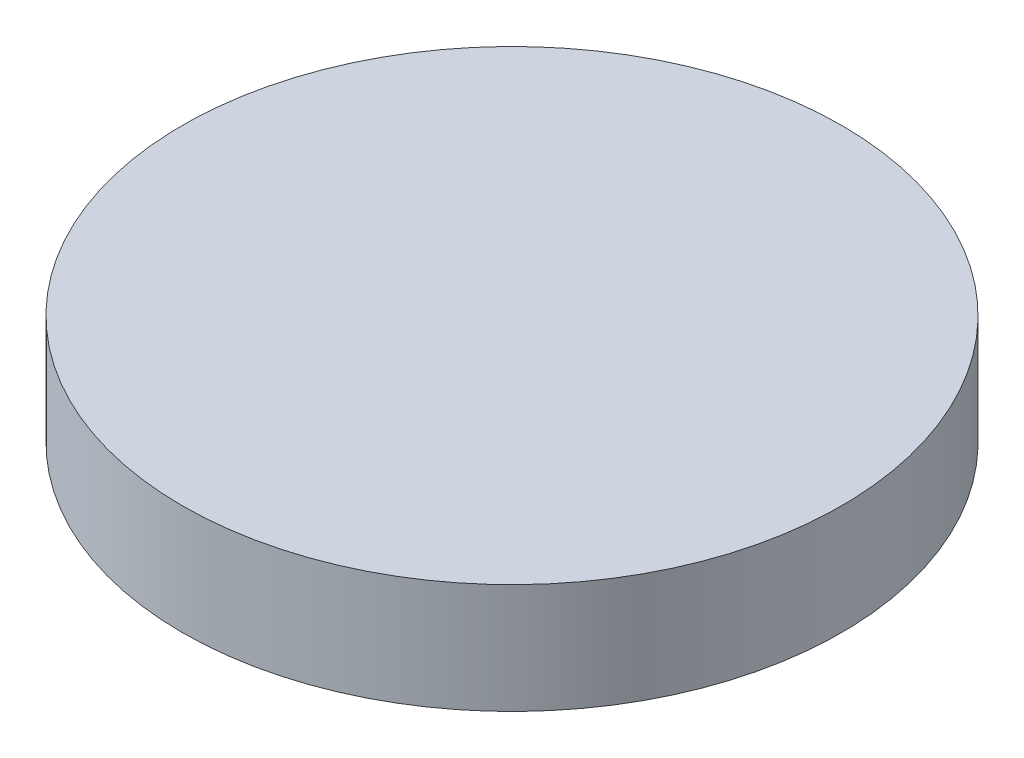
ISO-10303-21;
HEADER;
FILE_DESCRIPTION(('STEP AP214'),'2;1');
FILE_NAME('part.step','',(''),(''),'','','');
FILE_SCHEMA(('AUTOMOTIVE_DESIGN { 1 0 10303 214 1 1 1 1 }'));
ENDSEC;
DATA;
#1=APPLICATION_CONTEXT('core data for automotive mechanical design processes');
#2=APPLICATION_PROTOCOL_DEFINITION('international standard','automotive_design',2000,#1);
#3=PRODUCT_CONTEXT('',#1,'mechanical');
#4=PRODUCT('Part','Part','',(#3));
#5=PRODUCT_RELATED_PRODUCT_CATEGORY('part','',(#4));
#6=PRODUCT_DEFINITION_FORMATION('','',#4);
#7=PRODUCT_DEFINITION_CONTEXT('part definition',#1,'design');
#8=PRODUCT_DEFINITION('design','',#6,#7);
#9=PRODUCT_DEFINITION_SHAPE('','',#8);
#10=(LENGTH_UNIT() NAMED_UNIT(*) SI_UNIT(.MILLI.,.METRE.));
#11=(NAMED_UNIT(*) PLANE_ANGLE_UNIT() SI_UNIT($,.RADIAN.));
#12=(NAMED_UNIT(*) SI_UNIT($,.STERADIAN.) SOLID_ANGLE_UNIT());
#13=UNCERTAINTY_MEASURE_WITH_UNIT(LENGTH_MEASURE(1.E-05),#10,'distance_accuracy_value','');
#14=(GEOMETRIC_REPRESENTATION_CONTEXT(3) GLOBAL_UNCERTAINTY_ASSIGNED_CONTEXT((#13)) GLOBAL_UNIT_ASSIGNED_CONTEXT((#10,
#11,#12)) REPRESENTATION_CONTEXT('',''));
#15=CARTESIAN_POINT('',(0.,0.,0.));
#16=DIRECTION('',(0.,0.,1.));
#17=DIRECTION('',(1.,0.,0.));
#18=AXIS2_PLACEMENT_3D('',#15,#16,#17);
#19=CARTESIAN_POINT('',(0.,2.,0.));
#20=DIRECTION('',(0.,-1.,0.));
#21=DIRECTION('',(0.,0.,-1.));
#22=AXIS2_PLACEMENT_3D('',#19,#20,#21);
#23=CYLINDRICAL_SURFACE('',#22,6.);
#24=CARTESIAN_POINT('',(0.,2.,0.));
#25=DIRECTION('',(0.,1.,0.));
#26=DIRECTION('',(0.,0.,1.));
#27=AXIS2_PLACEMENT_3D('',#24,#25,#26);
#28=CIRCLE('',#27,6.);
#29=CARTESIAN_POINT('',(0.,2.,6.));
#30=VERTEX_POINT('',#29);
#31=EDGE_CURVE('E10',#30,#30,#28,.T.);
#32=ORIENTED_EDGE('',*,*,#31,.F.);
#33=EDGE_LOOP('',(#32));
#34=FACE_BOUND('',#33,.T.);
#35=CARTESIAN_POINT('',(0.,0.,0.));
#36=DIRECTION('',(0.,1.,0.));
#37=DIRECTION('',(0.,0.,1.));
#38=AXIS2_PLACEMENT_3D('',#35,#36,#37);
#39=CIRCLE('',#38,6.);
#40=CARTESIAN_POINT('',(0.,0.,6.));
#41=VERTEX_POINT('',#40);
#42=EDGE_CURVE('E34',#41,#41,#39,.T.);
#43=ORIENTED_EDGE('',*,*,#42,.T.);
#44=EDGE_LOOP('',(#43));
#45=FACE_BOUND('',#44,.T.);
#46=ADVANCED_FACE('F31',(#34,#45),#23,.T.);
#47=CARTESIAN_POINT('',(0.,2.,0.));
#48=DIRECTION('',(0.,1.,0.));
#49=DIRECTION('',(0.,0.,1.));
#50=AXIS2_PLACEMENT_3D('',#47,#48,#49);
#51=PLANE('',#50);
#52=ORIENTED_EDGE('',*,*,#31,.T.);
#53=EDGE_LOOP('',(#52));
#54=FACE_BOUND('',#53,.T.);
#55=ADVANCED_FACE('F46',(#54),#51,.T.);
#56=CARTESIAN_POINT('',(0.,0.,0.));
#57=DIRECTION('',(0.,1.,0.));
#58=DIRECTION('',(0.,0.,1.));
#59=AXIS2_PLACEMENT_3D('',#56,#57,#58);
#60=PLANE('',#59);
#61=ORIENTED_EDGE('',*,*,#42,.F.);
#62=EDGE_LOOP('',(#61));
#63=FACE_BOUND('',#62,.T.);
#64=ADVANCED_FACE('F44',(#63),#60,.F.);
#65=CLOSED_SHELL('',(#46,#55,#64));
#66=MANIFOLD_SOLID_BREP('B2',#65);
#67=ADVANCED_BREP_SHAPE_REPRESENTATION('',(#18,#66),#14);
#68=SHAPE_DEFINITION_REPRESENTATION(#9,#67);
ENDSEC;
END-ISO-10303-21;
